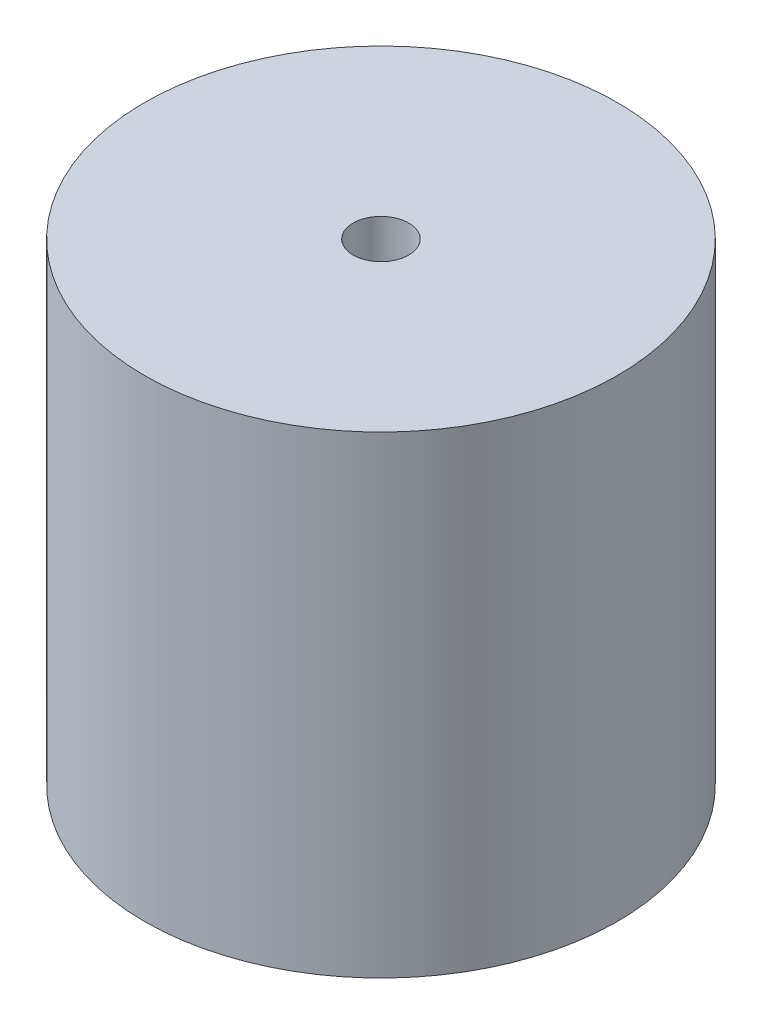
ISO-10303-21;
HEADER;
FILE_DESCRIPTION(('STEP AP214'),'2;1');
FILE_NAME('part.step','',(''),(''),'','','');
FILE_SCHEMA(('AUTOMOTIVE_DESIGN { 1 0 10303 214 1 1 1 1 }'));
ENDSEC;
DATA;
#1=APPLICATION_CONTEXT('core data for automotive mechanical design processes');
#2=APPLICATION_PROTOCOL_DEFINITION('international standard','automotive_design',2000,#1);
#3=PRODUCT_CONTEXT('',#1,'mechanical');
#4=PRODUCT('Part','Part','',(#3));
#5=PRODUCT_RELATED_PRODUCT_CATEGORY('part','',(#4));
#6=PRODUCT_DEFINITION_FORMATION('','',#4);
#7=PRODUCT_DEFINITION_CONTEXT('part definition',#1,'design');
#8=PRODUCT_DEFINITION('design','',#6,#7);
#9=PRODUCT_DEFINITION_SHAPE('','',#8);
#10=(LENGTH_UNIT() NAMED_UNIT(*) SI_UNIT(.MILLI.,.METRE.));
#11=(NAMED_UNIT(*) PLANE_ANGLE_UNIT() SI_UNIT($,.RADIAN.));
#12=(NAMED_UNIT(*) SI_UNIT($,.STERADIAN.) SOLID_ANGLE_UNIT());
#13=UNCERTAINTY_MEASURE_WITH_UNIT(LENGTH_MEASURE(1.E-05),#10,'distance_accuracy_value','');
#14=(GEOMETRIC_REPRESENTATION_CONTEXT(3) GLOBAL_UNCERTAINTY_ASSIGNED_CONTEXT((#13)) GLOBAL_UNIT_ASSIGNED_CONTEXT((#10,
#11,#12)) REPRESENTATION_CONTEXT('',''));
#15=CARTESIAN_POINT('',(0.,0.,0.));
#16=DIRECTION('',(0.,0.,1.));
#17=DIRECTION('',(1.,0.,0.));
#18=AXIS2_PLACEMENT_3D('',#15,#16,#17);
#19=CARTESIAN_POINT('',(0.,0.,0.));
#20=DIRECTION('',(0.,1.,0.));
#21=DIRECTION('',(0.,0.,1.));
#22=AXIS2_PLACEMENT_3D('',#19,#20,#21);
#23=CYLINDRICAL_SURFACE('',#22,1.175);
#24=CARTESIAN_POINT('',(0.,20.,0.));
#25=DIRECTION('',(0.,1.,0.));
#26=DIRECTION('',(0.,0.,1.));
#27=AXIS2_PLACEMENT_3D('',#24,#25,#26);
#28=CIRCLE('',#27,1.175);
#29=CARTESIAN_POINT('',(0.,20.,1.175));
#30=VERTEX_POINT('',#29);
#31=EDGE_CURVE('E44',#30,#30,#28,.T.);
#32=ORIENTED_EDGE('',*,*,#31,.T.);
#33=EDGE_LOOP('',(#32));
#34=FACE_BOUND('',#33,.T.);
#35=CARTESIAN_POINT('',(0.,15.,0.));
#36=DIRECTION('',(0.,-1.,0.));
#37=DIRECTION('',(0.,0.,-1.));
#38=AXIS2_PLACEMENT_3D('',#35,#36,#37);
#39=CIRCLE('',#38,1.175);
#40=CARTESIAN_POINT('',(0.,15.,-1.175));
#41=VERTEX_POINT('',#40);
#42=EDGE_CURVE('E35',#41,#41,#39,.F.);
#43=ORIENTED_EDGE('',*,*,#42,.F.);
#44=EDGE_LOOP('',(#43));
#45=FACE_BOUND('',#44,.T.);
#46=ADVANCED_FACE('F31',(#34,#45),#23,.F.);
#47=CARTESIAN_POINT('',(0.,20.,0.));
#48=DIRECTION('',(0.,-1.,0.));
#49=DIRECTION('',(0.,0.,-1.));
#50=AXIS2_PLACEMENT_3D('',#47,#48,#49);
#51=CYLINDRICAL_SURFACE('',#50,10.);
#52=CARTESIAN_POINT('',(0.,20.,0.));
#53=DIRECTION('',(0.,1.,0.));
#54=DIRECTION('',(0.,0.,1.));
#55=AXIS2_PLACEMENT_3D('',#52,#53,#54);
#56=CIRCLE('',#55,10.);
#57=CARTESIAN_POINT('',(0.,20.,10.));
#58=VERTEX_POINT('',#57);
#59=EDGE_CURVE('E10',#58,#58,#56,.T.);
#60=ORIENTED_EDGE('',*,*,#59,.F.);
#61=EDGE_LOOP('',(#60));
#62=FACE_BOUND('',#61,.T.);
#63=CARTESIAN_POINT('',(0.,0.,0.));
#64=DIRECTION('',(0.,1.,0.));
#65=DIRECTION('',(0.,0.,1.));
#66=AXIS2_PLACEMENT_3D('',#63,#64,#65);
#67=CIRCLE('',#66,10.);
#68=CARTESIAN_POINT('',(0.,0.,10.));
#69=VERTEX_POINT('',#68);
#70=EDGE_CURVE('E39',#69,#69,#67,.T.);
#71=ORIENTED_EDGE('',*,*,#70,.T.);
#72=EDGE_LOOP('',(#71));
#73=FACE_BOUND('',#72,.T.);
#74=ADVANCED_FACE('F33',(#62,#73),#51,.T.);
#75=CARTESIAN_POINT('',(0.,20.,0.));
#76=DIRECTION('',(0.,1.,0.));
#77=DIRECTION('',(0.,0.,1.));
#78=AXIS2_PLACEMENT_3D('',#75,#76,#77);
#79=PLANE('',#78);
#80=ORIENTED_EDGE('',*,*,#31,.F.);
#81=EDGE_LOOP('',(#80));
#82=FACE_BOUND('',#81,.T.);
#83=ORIENTED_EDGE('',*,*,#59,.T.);
#84=EDGE_LOOP('',(#83));
#85=FACE_BOUND('',#84,.T.);
#86=ADVANCED_FACE('F66',(#82,#85),#79,.T.);
#87=CARTESIAN_POINT('',(0.,0.,0.));
#88=DIRECTION('',(0.,1.,0.));
#89=DIRECTION('',(0.,0.,1.));
#90=AXIS2_PLACEMENT_3D('',#87,#88,#89);
#91=PLANE('',#90);
#92=CARTESIAN_POINT('',(0.,0.,0.));
#93=DIRECTION('',(0.,-1.,0.));
#94=DIRECTION('',(0.,0.,-1.));
#95=AXIS2_PLACEMENT_3D('',#92,#93,#94);
#96=CIRCLE('',#95,2.45);
#97=CARTESIAN_POINT('',(0.,0.,-2.45));
#98=VERTEX_POINT('',#97);
#99=EDGE_CURVE('E48',#98,#98,#96,.T.);
#100=ORIENTED_EDGE('',*,*,#99,.F.);
#101=EDGE_LOOP('',(#100));
#102=FACE_BOUND('',#101,.T.);
#103=ORIENTED_EDGE('',*,*,#70,.F.);
#104=EDGE_LOOP('',(#103));
#105=FACE_BOUND('',#104,.T.);
#106=ADVANCED_FACE('F73',(#102,#105),#91,.F.);
#107=CARTESIAN_POINT('',(0.,15.,0.));
#108=DIRECTION('',(0.,-1.,0.));
#109=DIRECTION('',(0.,0.,-1.));
#110=AXIS2_PLACEMENT_3D('',#107,#108,#109);
#111=PLANE('',#110);
#112=CARTESIAN_POINT('',(0.,15.,0.));
#113=DIRECTION('',(0.,-1.,0.));
#114=DIRECTION('',(0.,0.,-1.));
#115=AXIS2_PLACEMENT_3D('',#112,#113,#114);
#116=CIRCLE('',#115,2.45);
#117=CARTESIAN_POINT('',(0.,15.,-2.45));
#118=VERTEX_POINT('',#117);
#119=EDGE_CURVE('E51',#118,#118,#116,.T.);
#120=ORIENTED_EDGE('',*,*,#119,.T.);
#121=EDGE_LOOP('',(#120));
#122=FACE_BOUND('',#121,.T.);
#123=ORIENTED_EDGE('',*,*,#42,.T.);
#124=EDGE_LOOP('',(#123));
#125=FACE_BOUND('',#124,.T.);
#126=ADVANCED_FACE('F58',(#122,#125),#111,.T.);
#127=CARTESIAN_POINT('',(0.,15.,0.));
#128=DIRECTION('',(0.,-1.,0.));
#129=DIRECTION('',(0.,0.,-1.));
#130=AXIS2_PLACEMENT_3D('',#127,#128,#129);
#131=CYLINDRICAL_SURFACE('',#130,2.45);
#132=ORIENTED_EDGE('',*,*,#119,.F.);
#133=EDGE_LOOP('',(#132));
#134=FACE_BOUND('',#133,.T.);
#135=ORIENTED_EDGE('',*,*,#99,.T.);
#136=EDGE_LOOP('',(#135));
#137=FACE_BOUND('',#136,.T.);
#138=ADVANCED_FACE('F70',(#134,#137),#131,.F.);
#139=CLOSED_SHELL('',(#46,#74,#86,#106,#126,#138));
#140=MANIFOLD_SOLID_BREP('B2',#139);
#141=ADVANCED_BREP_SHAPE_REPRESENTATION('',(#18,#140),#14);
#142=SHAPE_DEFINITION_REPRESENTATION(#9,#141);
ENDSEC;
END-ISO-10303-21;
